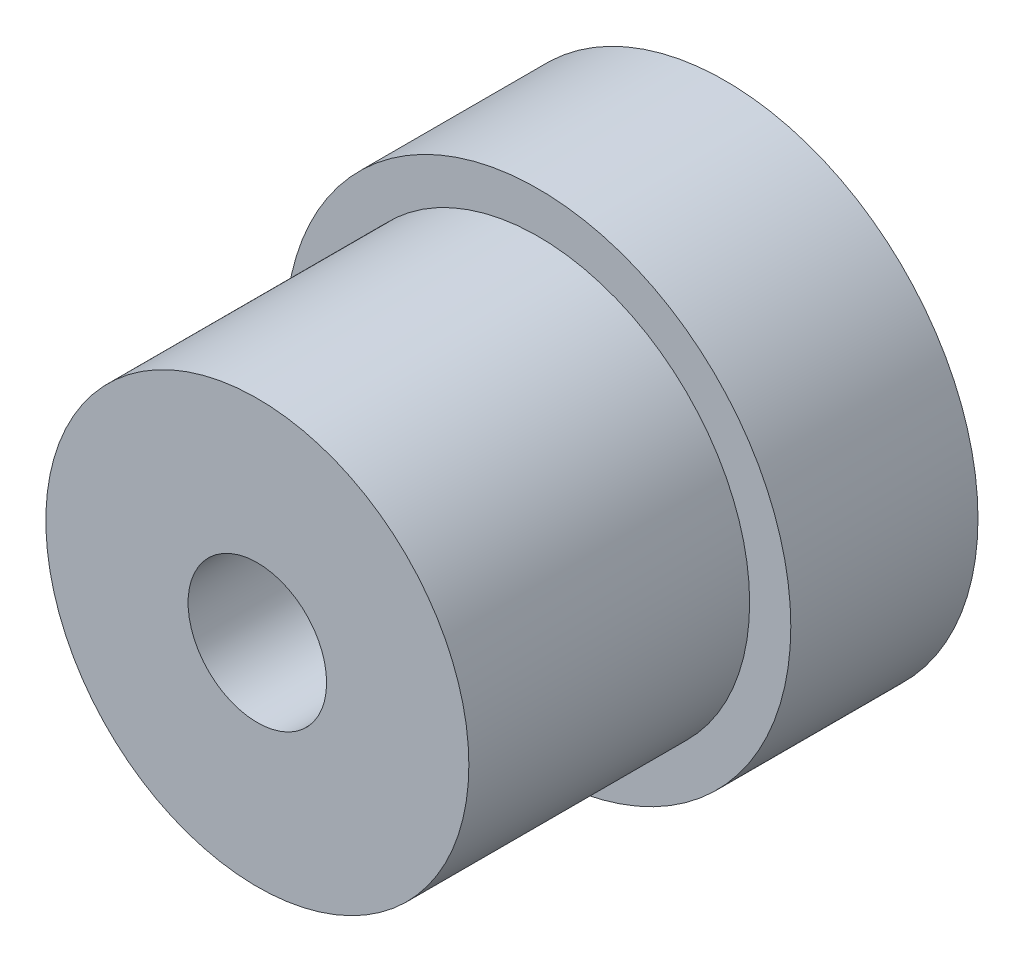
ISO-10303-21;
HEADER;
FILE_DESCRIPTION(('STEP AP214'),'2;1');
FILE_NAME('part.step','',(''),(''),'','','');
FILE_SCHEMA(('AUTOMOTIVE_DESIGN { 1 0 10303 214 1 1 1 1 }'));
ENDSEC;
DATA;
#1=APPLICATION_CONTEXT('core data for automotive mechanical design processes');
#2=APPLICATION_PROTOCOL_DEFINITION('international standard','automotive_design',2000,#1);
#3=PRODUCT_CONTEXT('',#1,'mechanical');
#4=PRODUCT('Part','Part','',(#3));
#5=PRODUCT_RELATED_PRODUCT_CATEGORY('part','',(#4));
#6=PRODUCT_DEFINITION_FORMATION('','',#4);
#7=PRODUCT_DEFINITION_CONTEXT('part definition',#1,'design');
#8=PRODUCT_DEFINITION('design','',#6,#7);
#9=PRODUCT_DEFINITION_SHAPE('','',#8);
#10=(LENGTH_UNIT() NAMED_UNIT(*) SI_UNIT(.MILLI.,.METRE.));
#11=(NAMED_UNIT(*) PLANE_ANGLE_UNIT() SI_UNIT($,.RADIAN.));
#12=(NAMED_UNIT(*) SI_UNIT($,.STERADIAN.) SOLID_ANGLE_UNIT());
#13=UNCERTAINTY_MEASURE_WITH_UNIT(LENGTH_MEASURE(1.E-05),#10,'distance_accuracy_value','');
#14=(GEOMETRIC_REPRESENTATION_CONTEXT(3) GLOBAL_UNCERTAINTY_ASSIGNED_CONTEXT((#13)) GLOBAL_UNIT_ASSIGNED_CONTEXT((#10,
#11,#12)) REPRESENTATION_CONTEXT('',''));
#15=CARTESIAN_POINT('',(0.,0.,0.));
#16=DIRECTION('',(0.,0.,1.));
#17=DIRECTION('',(1.,0.,0.));
#18=AXIS2_PLACEMENT_3D('',#15,#16,#17);
#19=CARTESIAN_POINT('',(0.,0.,10.));
#20=DIRECTION('',(0.,0.,-1.));
#21=DIRECTION('',(-1.,0.,0.));
#22=AXIS2_PLACEMENT_3D('',#19,#20,#21);
#23=CYLINDRICAL_SURFACE('',#22,13.5);
#24=CARTESIAN_POINT('',(0.,0.,10.));
#25=DIRECTION('',(0.,0.,1.));
#26=DIRECTION('',(1.,0.,0.));
#27=AXIS2_PLACEMENT_3D('',#24,#25,#26);
#28=CIRCLE('',#27,13.5);
#29=CARTESIAN_POINT('',(13.5,0.,10.));
#30=VERTEX_POINT('',#29);
#31=EDGE_CURVE('E53',#30,#30,#28,.T.);
#32=ORIENTED_EDGE('',*,*,#31,.F.);
#33=EDGE_LOOP('',(#32));
#34=FACE_BOUND('',#33,.T.);
#35=CARTESIAN_POINT('',(0.,0.,0.));
#36=DIRECTION('',(0.,0.,1.));
#37=DIRECTION('',(1.,0.,0.));
#38=AXIS2_PLACEMENT_3D('',#35,#36,#37);
#39=CIRCLE('',#38,13.5);
#40=CARTESIAN_POINT('',(13.5,0.,0.));
#41=VERTEX_POINT('',#40);
#42=EDGE_CURVE('E49',#41,#41,#39,.T.);
#43=ORIENTED_EDGE('',*,*,#42,.T.);
#44=EDGE_LOOP('',(#43));
#45=FACE_BOUND('',#44,.T.);
#46=ADVANCED_FACE('F50',(#34,#45),#23,.T.);
#47=CARTESIAN_POINT('',(0.,0.,10.));
#48=DIRECTION('',(0.,0.,1.));
#49=DIRECTION('',(1.,0.,0.));
#50=AXIS2_PLACEMENT_3D('',#47,#48,#49);
#51=PLANE('',#50);
#52=CARTESIAN_POINT('',(0.,0.,10.));
#53=DIRECTION('',(0.,0.,1.));
#54=DIRECTION('',(1.,0.,0.));
#55=AXIS2_PLACEMENT_3D('',#52,#53,#54);
#56=CIRCLE('',#55,11.3);
#57=CARTESIAN_POINT('',(11.3,0.,10.));
#58=VERTEX_POINT('',#57);
#59=EDGE_CURVE('E11',#58,#58,#56,.T.);
#60=ORIENTED_EDGE('',*,*,#59,.F.);
#61=EDGE_LOOP('',(#60));
#62=FACE_BOUND('',#61,.T.);
#63=ORIENTED_EDGE('',*,*,#31,.T.);
#64=EDGE_LOOP('',(#63));
#65=FACE_BOUND('',#64,.T.);
#66=ADVANCED_FACE('F94',(#62,#65),#51,.T.);
#67=CARTESIAN_POINT('',(0.,0.,0.));
#68=DIRECTION('',(0.,0.,1.));
#69=DIRECTION('',(1.,0.,0.));
#70=AXIS2_PLACEMENT_3D('',#67,#68,#69);
#71=PLANE('',#70);
#72=CARTESIAN_POINT('',(0.,0.,0.));
#73=DIRECTION('',(0.,0.,1.));
#74=DIRECTION('',(1.,0.,0.));
#75=AXIS2_PLACEMENT_3D('',#72,#73,#74);
#76=CIRCLE('',#75,3.7);
#77=CARTESIAN_POINT('',(3.7,0.,0.));
#78=VERTEX_POINT('',#77);
#79=EDGE_CURVE('E63',#78,#78,#76,.T.);
#80=ORIENTED_EDGE('',*,*,#79,.T.);
#81=EDGE_LOOP('',(#80));
#82=FACE_BOUND('',#81,.T.);
#83=ORIENTED_EDGE('',*,*,#42,.F.);
#84=EDGE_LOOP('',(#83));
#85=FACE_BOUND('',#84,.T.);
#86=ADVANCED_FACE('F74',(#82,#85),#71,.F.);
#87=CARTESIAN_POINT('',(0.,0.,25.));
#88=DIRECTION('',(0.,0.,-1.));
#89=DIRECTION('',(-1.,0.,0.));
#90=AXIS2_PLACEMENT_3D('',#87,#88,#89);
#91=CYLINDRICAL_SURFACE('',#90,11.3);
#92=CARTESIAN_POINT('',(0.,0.,25.));
#93=DIRECTION('',(0.,0.,1.));
#94=DIRECTION('',(1.,0.,0.));
#95=AXIS2_PLACEMENT_3D('',#92,#93,#94);
#96=CIRCLE('',#95,11.3);
#97=CARTESIAN_POINT('',(11.3,0.,25.));
#98=VERTEX_POINT('',#97);
#99=EDGE_CURVE('E61',#98,#98,#96,.T.);
#100=ORIENTED_EDGE('',*,*,#99,.F.);
#101=EDGE_LOOP('',(#100));
#102=FACE_BOUND('',#101,.T.);
#103=ORIENTED_EDGE('',*,*,#59,.T.);
#104=EDGE_LOOP('',(#103));
#105=FACE_BOUND('',#104,.T.);
#106=ADVANCED_FACE('F88',(#102,#105),#91,.T.);
#107=CARTESIAN_POINT('',(0.,0.,25.));
#108=DIRECTION('',(0.,0.,1.));
#109=DIRECTION('',(1.,0.,0.));
#110=AXIS2_PLACEMENT_3D('',#107,#108,#109);
#111=PLANE('',#110);
#112=CARTESIAN_POINT('',(0.,0.,25.));
#113=DIRECTION('',(0.,0.,1.));
#114=DIRECTION('',(1.,0.,0.));
#115=AXIS2_PLACEMENT_3D('',#112,#113,#114);
#116=CIRCLE('',#115,3.7);
#117=CARTESIAN_POINT('',(3.7,0.,25.));
#118=VERTEX_POINT('',#117);
#119=EDGE_CURVE('E65',#118,#118,#116,.T.);
#120=ORIENTED_EDGE('',*,*,#119,.F.);
#121=EDGE_LOOP('',(#120));
#122=FACE_BOUND('',#121,.T.);
#123=ORIENTED_EDGE('',*,*,#99,.T.);
#124=EDGE_LOOP('',(#123));
#125=FACE_BOUND('',#124,.T.);
#126=ADVANCED_FACE('F80',(#122,#125),#111,.T.);
#127=CARTESIAN_POINT('',(0.,0.,0.));
#128=DIRECTION('',(0.,0.,1.));
#129=DIRECTION('',(1.,0.,0.));
#130=AXIS2_PLACEMENT_3D('',#127,#128,#129);
#131=CYLINDRICAL_SURFACE('',#130,3.7);
#132=ORIENTED_EDGE('',*,*,#79,.F.);
#133=EDGE_LOOP('',(#132));
#134=FACE_BOUND('',#133,.T.);
#135=ORIENTED_EDGE('',*,*,#119,.T.);
#136=EDGE_LOOP('',(#135));
#137=FACE_BOUND('',#136,.T.);
#138=ADVANCED_FACE('F77',(#134,#137),#131,.F.);
#139=CLOSED_SHELL('',(#46,#66,#86,#106,#126,#138));
#140=MANIFOLD_SOLID_BREP('B2',#139);
#141=ADVANCED_BREP_SHAPE_REPRESENTATION('',(#18,#140),#14);
#142=SHAPE_DEFINITION_REPRESENTATION(#9,#141);
ENDSEC;
END-ISO-10303-21;
